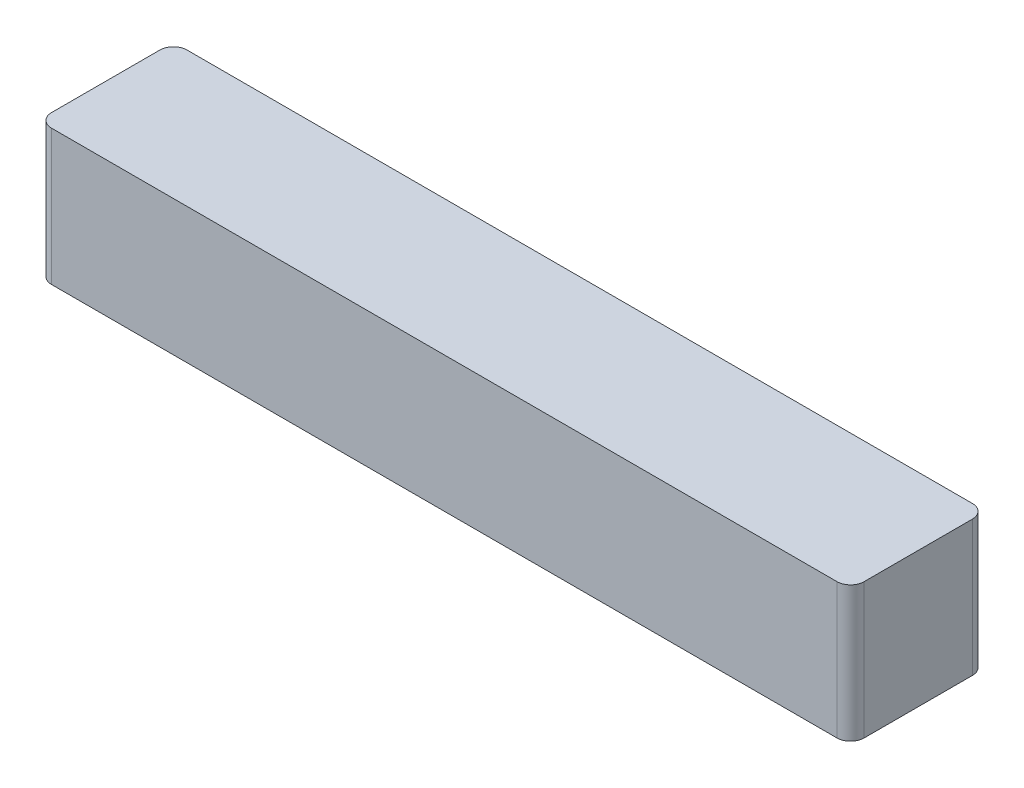
ISO-10303-21;
HEADER;
FILE_DESCRIPTION(('STEP AP214'),'2;1');
FILE_NAME('part.step','',(''),(''),'','','');
FILE_SCHEMA(('AUTOMOTIVE_DESIGN { 1 0 10303 214 1 1 1 1 }'));
ENDSEC;
DATA;
#1=APPLICATION_CONTEXT('core data for automotive mechanical design processes');
#2=APPLICATION_PROTOCOL_DEFINITION('international standard','automotive_design',2000,#1);
#3=PRODUCT_CONTEXT('',#1,'mechanical');
#4=PRODUCT('Part','Part','',(#3));
#5=PRODUCT_RELATED_PRODUCT_CATEGORY('part','',(#4));
#6=PRODUCT_DEFINITION_FORMATION('','',#4);
#7=PRODUCT_DEFINITION_CONTEXT('part definition',#1,'design');
#8=PRODUCT_DEFINITION('design','',#6,#7);
#9=PRODUCT_DEFINITION_SHAPE('','',#8);
#10=(LENGTH_UNIT() NAMED_UNIT(*) SI_UNIT(.MILLI.,.METRE.));
#11=(NAMED_UNIT(*) PLANE_ANGLE_UNIT() SI_UNIT($,.RADIAN.));
#12=(NAMED_UNIT(*) SI_UNIT($,.STERADIAN.) SOLID_ANGLE_UNIT());
#13=UNCERTAINTY_MEASURE_WITH_UNIT(LENGTH_MEASURE(1.E-05),#10,'distance_accuracy_value','');
#14=(GEOMETRIC_REPRESENTATION_CONTEXT(3) GLOBAL_UNCERTAINTY_ASSIGNED_CONTEXT((#13)) GLOBAL_UNIT_ASSIGNED_CONTEXT((#10,
#11,#12)) REPRESENTATION_CONTEXT('',''));
#15=CARTESIAN_POINT('',(0.,0.,0.));
#16=DIRECTION('',(0.,0.,1.));
#17=DIRECTION('',(1.,0.,0.));
#18=AXIS2_PLACEMENT_3D('',#15,#16,#17);
#19=CARTESIAN_POINT('',(0.,6.35,0.));
#20=DIRECTION('',(1.,0.,0.));
#21=DIRECTION('',(0.,0.,-1.));
#22=AXIS2_PLACEMENT_3D('',#19,#20,#21);
#23=PLANE('',#22);
#24=CARTESIAN_POINT('',(0.,3.175,-3.175));
#25=DIRECTION('',(-1.,0.,0.));
#26=DIRECTION('',(0.,0.,1.));
#27=AXIS2_PLACEMENT_3D('',#24,#25,#26);
#28=CIRCLE('',#27,2.4003);
#29=CARTESIAN_POINT('',(0.,3.175,-0.774700000000001));
#30=VERTEX_POINT('',#29);
#31=EDGE_CURVE('E176',#30,#30,#28,.T.);
#32=ORIENTED_EDGE('',*,*,#31,.F.);
#33=EDGE_LOOP('',(#32));
#34=FACE_BOUND('',#33,.T.);
#35=DIRECTION('',(0.,0.,1.));
#36=VECTOR('',#35,1.);
#37=CARTESIAN_POINT('',(0.,0.,0.));
#38=LINE('',#37,#36);
#39=CARTESIAN_POINT('',(0.,0.,-5.715));
#40=VERTEX_POINT('',#39);
#41=CARTESIAN_POINT('',(0.,0.,-0.635));
#42=VERTEX_POINT('',#41);
#43=EDGE_CURVE('E126',#40,#42,#38,.T.);
#44=ORIENTED_EDGE('',*,*,#43,.T.);
#45=DIRECTION('',(0.,-1.,0.));
#46=VECTOR('',#45,1.);
#47=CARTESIAN_POINT('',(0.,6.35,-0.635));
#48=LINE('',#47,#46);
#49=CARTESIAN_POINT('',(0.,6.35,-0.635));
#50=VERTEX_POINT('',#49);
#51=EDGE_CURVE('E104',#42,#50,#48,.F.);
#52=ORIENTED_EDGE('',*,*,#51,.T.);
#53=DIRECTION('',(0.,0.,1.));
#54=VECTOR('',#53,1.);
#55=CARTESIAN_POINT('',(0.,6.35,0.));
#56=LINE('',#55,#54);
#57=CARTESIAN_POINT('',(0.,6.35,-5.715));
#58=VERTEX_POINT('',#57);
#59=EDGE_CURVE('E136',#58,#50,#56,.T.);
#60=ORIENTED_EDGE('',*,*,#59,.F.);
#61=DIRECTION('',(0.,-1.,0.));
#62=VECTOR('',#61,1.);
#63=CARTESIAN_POINT('',(0.,6.35,-5.715));
#64=LINE('',#63,#62);
#65=EDGE_CURVE('E109',#58,#40,#64,.T.);
#66=ORIENTED_EDGE('',*,*,#65,.T.);
#67=EDGE_LOOP('',(#44,#52,#60,#66));
#68=FACE_BOUND('',#67,.T.);
#69=ADVANCED_FACE('F33',(#34,#68),#23,.F.);
#70=CARTESIAN_POINT('',(0.,6.35,0.));
#71=DIRECTION('',(0.,0.,-1.));
#72=DIRECTION('',(-1.,0.,0.));
#73=AXIS2_PLACEMENT_3D('',#70,#71,#72);
#74=PLANE('',#73);
#75=DIRECTION('',(1.,0.,0.));
#76=VECTOR('',#75,1.);
#77=CARTESIAN_POINT('',(0.,6.35,0.));
#78=LINE('',#77,#76);
#79=CARTESIAN_POINT('',(0.635,6.35,0.));
#80=VERTEX_POINT('',#79);
#81=CARTESIAN_POINT('',(37.465,6.35,0.));
#82=VERTEX_POINT('',#81);
#83=EDGE_CURVE('E119',#80,#82,#78,.T.);
#84=ORIENTED_EDGE('',*,*,#83,.F.);
#85=DIRECTION('',(0.,-1.,0.));
#86=VECTOR('',#85,1.);
#87=CARTESIAN_POINT('',(0.635,6.35,0.));
#88=LINE('',#87,#86);
#89=CARTESIAN_POINT('',(0.635,0.,0.));
#90=VERTEX_POINT('',#89);
#91=EDGE_CURVE('E103',#80,#90,#88,.T.);
#92=ORIENTED_EDGE('',*,*,#91,.T.);
#93=DIRECTION('',(1.,0.,0.));
#94=VECTOR('',#93,1.);
#95=CARTESIAN_POINT('',(0.,0.,0.));
#96=LINE('',#95,#94);
#97=CARTESIAN_POINT('',(37.465,0.,0.));
#98=VERTEX_POINT('',#97);
#99=EDGE_CURVE('E116',#90,#98,#96,.T.);
#100=ORIENTED_EDGE('',*,*,#99,.T.);
#101=DIRECTION('',(0.,-1.,0.));
#102=VECTOR('',#101,1.);
#103=CARTESIAN_POINT('',(37.465,6.35,0.));
#104=LINE('',#103,#102);
#105=EDGE_CURVE('E121',#98,#82,#104,.F.);
#106=ORIENTED_EDGE('',*,*,#105,.T.);
#107=EDGE_LOOP('',(#84,#92,#100,#106));
#108=FACE_BOUND('',#107,.T.);
#109=ADVANCED_FACE('F115',(#108),#74,.F.);
#110=CARTESIAN_POINT('',(38.1,6.35,0.));
#111=DIRECTION('',(-1.,0.,0.));
#112=DIRECTION('',(0.,0.,1.));
#113=AXIS2_PLACEMENT_3D('',#110,#111,#112);
#114=PLANE('',#113);
#115=DIRECTION('',(0.,0.,-1.));
#116=VECTOR('',#115,1.);
#117=CARTESIAN_POINT('',(38.1,0.,0.));
#118=LINE('',#117,#116);
#119=CARTESIAN_POINT('',(38.1,0.,-0.635));
#120=VERTEX_POINT('',#119);
#121=CARTESIAN_POINT('',(38.1,0.,-5.715));
#122=VERTEX_POINT('',#121);
#123=EDGE_CURVE('E125',#120,#122,#118,.T.);
#124=ORIENTED_EDGE('',*,*,#123,.T.);
#125=DIRECTION('',(0.,-1.,0.));
#126=VECTOR('',#125,1.);
#127=CARTESIAN_POINT('',(38.1,6.35,-5.715));
#128=LINE('',#127,#126);
#129=CARTESIAN_POINT('',(38.1,6.35,-5.715));
#130=VERTEX_POINT('',#129);
#131=EDGE_CURVE('E11',#122,#130,#128,.F.);
#132=ORIENTED_EDGE('',*,*,#131,.T.);
#133=DIRECTION('',(0.,0.,-1.));
#134=VECTOR('',#133,1.);
#135=CARTESIAN_POINT('',(38.1,6.35,0.));
#136=LINE('',#135,#134);
#137=CARTESIAN_POINT('',(38.1,6.35,-0.635));
#138=VERTEX_POINT('',#137);
#139=EDGE_CURVE('E162',#138,#130,#136,.T.);
#140=ORIENTED_EDGE('',*,*,#139,.F.);
#141=DIRECTION('',(0.,-1.,0.));
#142=VECTOR('',#141,1.);
#143=CARTESIAN_POINT('',(38.1,6.35,-0.635));
#144=LINE('',#143,#142);
#145=EDGE_CURVE('E41',#138,#120,#144,.T.);
#146=ORIENTED_EDGE('',*,*,#145,.T.);
#147=EDGE_LOOP('',(#124,#132,#140,#146));
#148=FACE_BOUND('',#147,.T.);
#149=ADVANCED_FACE('F160',(#148),#114,.F.);
#150=CARTESIAN_POINT('',(0.,6.35,-6.35));
#151=DIRECTION('',(0.,0.,1.));
#152=DIRECTION('',(1.,0.,0.));
#153=AXIS2_PLACEMENT_3D('',#150,#151,#152);
#154=PLANE('',#153);
#155=DIRECTION('',(-1.,0.,0.));
#156=VECTOR('',#155,1.);
#157=CARTESIAN_POINT('',(0.,0.,-6.35));
#158=LINE('',#157,#156);
#159=CARTESIAN_POINT('',(37.465,0.,-6.35));
#160=VERTEX_POINT('',#159);
#161=CARTESIAN_POINT('',(0.635,0.,-6.35));
#162=VERTEX_POINT('',#161);
#163=EDGE_CURVE('E129',#160,#162,#158,.T.);
#164=ORIENTED_EDGE('',*,*,#163,.T.);
#165=DIRECTION('',(0.,-1.,0.));
#166=VECTOR('',#165,1.);
#167=CARTESIAN_POINT('',(0.635,6.35,-6.35));
#168=LINE('',#167,#166);
#169=CARTESIAN_POINT('',(0.635,6.35,-6.35));
#170=VERTEX_POINT('',#169);
#171=EDGE_CURVE('E48',#162,#170,#168,.F.);
#172=ORIENTED_EDGE('',*,*,#171,.T.);
#173=DIRECTION('',(-1.,0.,0.));
#174=VECTOR('',#173,1.);
#175=CARTESIAN_POINT('',(0.,6.35,-6.35));
#176=LINE('',#175,#174);
#177=CARTESIAN_POINT('',(37.465,6.35,-6.35));
#178=VERTEX_POINT('',#177);
#179=EDGE_CURVE('E137',#178,#170,#176,.T.);
#180=ORIENTED_EDGE('',*,*,#179,.F.);
#181=DIRECTION('',(0.,-1.,0.));
#182=VECTOR('',#181,1.);
#183=CARTESIAN_POINT('',(37.465,6.35,-6.35));
#184=LINE('',#183,#182);
#185=EDGE_CURVE('E153',#178,#160,#184,.T.);
#186=ORIENTED_EDGE('',*,*,#185,.T.);
#187=EDGE_LOOP('',(#164,#172,#180,#186));
#188=FACE_BOUND('',#187,.T.);
#189=ADVANCED_FACE('F169',(#188),#154,.F.);
#190=CARTESIAN_POINT('',(0.,6.35,0.));
#191=DIRECTION('',(0.,-1.,0.));
#192=DIRECTION('',(0.,0.,-1.));
#193=AXIS2_PLACEMENT_3D('',#190,#191,#192);
#194=PLANE('',#193);
#195=ORIENTED_EDGE('',*,*,#59,.T.);
#196=CARTESIAN_POINT('',(0.635,6.35,-0.635));
#197=DIRECTION('',(0.,-1.,0.));
#198=DIRECTION('',(0.,0.,-1.));
#199=AXIS2_PLACEMENT_3D('',#196,#197,#198);
#200=CIRCLE('',#199,0.635);
#201=EDGE_CURVE('E151',#50,#80,#200,.F.);
#202=ORIENTED_EDGE('',*,*,#201,.T.);
#203=ORIENTED_EDGE('',*,*,#83,.T.);
#204=CARTESIAN_POINT('',(37.465,6.35,-0.635));
#205=DIRECTION('',(0.,-1.,0.));
#206=DIRECTION('',(0.,0.,-1.));
#207=AXIS2_PLACEMENT_3D('',#204,#205,#206);
#208=CIRCLE('',#207,0.635);
#209=EDGE_CURVE('E146',#82,#138,#208,.F.);
#210=ORIENTED_EDGE('',*,*,#209,.T.);
#211=ORIENTED_EDGE('',*,*,#139,.T.);
#212=CARTESIAN_POINT('',(37.465,6.35,-5.715));
#213=DIRECTION('',(0.,-1.,0.));
#214=DIRECTION('',(0.,0.,-1.));
#215=AXIS2_PLACEMENT_3D('',#212,#213,#214);
#216=CIRCLE('',#215,0.635);
#217=EDGE_CURVE('E55',#130,#178,#216,.F.);
#218=ORIENTED_EDGE('',*,*,#217,.T.);
#219=ORIENTED_EDGE('',*,*,#179,.T.);
#220=CARTESIAN_POINT('',(0.635,6.35,-5.715));
#221=DIRECTION('',(0.,-1.,0.));
#222=DIRECTION('',(0.,0.,-1.));
#223=AXIS2_PLACEMENT_3D('',#220,#221,#222);
#224=CIRCLE('',#223,0.635);
#225=EDGE_CURVE('E149',#170,#58,#224,.F.);
#226=ORIENTED_EDGE('',*,*,#225,.T.);
#227=EDGE_LOOP('',(#195,#202,#203,#210,#211,#218,#219,#226));
#228=FACE_BOUND('',#227,.T.);
#229=ADVANCED_FACE('F206',(#228),#194,.F.);
#230=CARTESIAN_POINT('',(0.,0.,0.));
#231=DIRECTION('',(0.,-1.,0.));
#232=DIRECTION('',(0.,0.,-1.));
#233=AXIS2_PLACEMENT_3D('',#230,#231,#232);
#234=PLANE('',#233);
#235=CARTESIAN_POINT('',(11.43,0.,-3.175));
#236=DIRECTION('',(0.,-1.,0.));
#237=DIRECTION('',(0.,0.,-1.));
#238=AXIS2_PLACEMENT_3D('',#235,#236,#237);
#239=CIRCLE('',#238,0.889000000000002);
#240=CARTESIAN_POINT('',(11.43,0.,-4.064));
#241=VERTEX_POINT('',#240);
#242=EDGE_CURVE('E188',#241,#241,#239,.T.);
#243=ORIENTED_EDGE('',*,*,#242,.F.);
#244=EDGE_LOOP('',(#243));
#245=FACE_BOUND('',#244,.T.);
#246=CARTESIAN_POINT('',(26.67,0.,-3.175));
#247=DIRECTION('',(0.,-1.,0.));
#248=DIRECTION('',(0.,0.,1.));
#249=AXIS2_PLACEMENT_3D('',#246,#247,#248);
#250=CIRCLE('',#249,0.889);
#251=CARTESIAN_POINT('',(26.67,0.,-4.064));
#252=VERTEX_POINT('',#251);
#253=EDGE_CURVE('E182',#252,#252,#250,.T.);
#254=ORIENTED_EDGE('',*,*,#253,.F.);
#255=EDGE_LOOP('',(#254));
#256=FACE_BOUND('',#255,.T.);
#257=ORIENTED_EDGE('',*,*,#99,.F.);
#258=CARTESIAN_POINT('',(0.635,0.,-0.635));
#259=DIRECTION('',(0.,-1.,0.));
#260=DIRECTION('',(0.,0.,-1.));
#261=AXIS2_PLACEMENT_3D('',#258,#259,#260);
#262=CIRCLE('',#261,0.635);
#263=EDGE_CURVE('E99',#90,#42,#262,.T.);
#264=ORIENTED_EDGE('',*,*,#263,.T.);
#265=ORIENTED_EDGE('',*,*,#43,.F.);
#266=CARTESIAN_POINT('',(0.635,0.,-5.715));
#267=DIRECTION('',(0.,-1.,0.));
#268=DIRECTION('',(0.,0.,-1.));
#269=AXIS2_PLACEMENT_3D('',#266,#267,#268);
#270=CIRCLE('',#269,0.635);
#271=EDGE_CURVE('E110',#40,#162,#270,.T.);
#272=ORIENTED_EDGE('',*,*,#271,.T.);
#273=ORIENTED_EDGE('',*,*,#163,.F.);
#274=CARTESIAN_POINT('',(37.465,0.,-5.715));
#275=DIRECTION('',(0.,-1.,0.));
#276=DIRECTION('',(0.,0.,-1.));
#277=AXIS2_PLACEMENT_3D('',#274,#275,#276);
#278=CIRCLE('',#277,0.635);
#279=EDGE_CURVE('E140',#160,#122,#278,.T.);
#280=ORIENTED_EDGE('',*,*,#279,.T.);
#281=ORIENTED_EDGE('',*,*,#123,.F.);
#282=CARTESIAN_POINT('',(37.465,0.,-0.635));
#283=DIRECTION('',(0.,-1.,0.));
#284=DIRECTION('',(0.,0.,-1.));
#285=AXIS2_PLACEMENT_3D('',#282,#283,#284);
#286=CIRCLE('',#285,0.635);
#287=EDGE_CURVE('E120',#120,#98,#286,.T.);
#288=ORIENTED_EDGE('',*,*,#287,.T.);
#289=EDGE_LOOP('',(#257,#264,#265,#272,#273,#280,#281,#288));
#290=FACE_BOUND('',#289,.T.);
#291=ADVANCED_FACE('F123',(#245,#256,#290),#234,.T.);
#292=CARTESIAN_POINT('',(8.89,3.175,-3.175));
#293=DIRECTION('',(-1.,0.,0.));
#294=DIRECTION('',(0.,0.,1.));
#295=AXIS2_PLACEMENT_3D('',#292,#293,#294);
#296=CYLINDRICAL_SURFACE('',#295,2.4003);
#297=CARTESIAN_POINT('',(8.89,3.175,-3.175));
#298=DIRECTION('',(-1.,0.,0.));
#299=DIRECTION('',(0.,0.,1.));
#300=AXIS2_PLACEMENT_3D('',#297,#298,#299);
#301=CIRCLE('',#300,2.4003);
#302=CARTESIAN_POINT('',(8.89,3.175,-0.774700000000001));
#303=VERTEX_POINT('',#302);
#304=EDGE_CURVE('E131',#303,#303,#301,.T.);
#305=ORIENTED_EDGE('',*,*,#304,.F.);
#306=EDGE_LOOP('',(#305));
#307=FACE_BOUND('',#306,.T.);
#308=ORIENTED_EDGE('',*,*,#31,.T.);
#309=EDGE_LOOP('',(#308));
#310=FACE_BOUND('',#309,.T.);
#311=ADVANCED_FACE('F205',(#307,#310),#296,.F.);
#312=CARTESIAN_POINT('',(8.89,3.175,-3.175));
#313=DIRECTION('',(-1.,0.,0.));
#314=DIRECTION('',(0.,0.,1.));
#315=AXIS2_PLACEMENT_3D('',#312,#313,#314);
#316=PLANE('',#315);
#317=ORIENTED_EDGE('',*,*,#304,.T.);
#318=EDGE_LOOP('',(#317));
#319=FACE_BOUND('',#318,.T.);
#320=ADVANCED_FACE('F236',(#319),#316,.T.);
#321=CARTESIAN_POINT('',(0.635,6.35,-0.635));
#322=DIRECTION('',(0.,-1.,0.));
#323=DIRECTION('',(0.,0.,-1.));
#324=AXIS2_PLACEMENT_3D('',#321,#322,#323);
#325=CYLINDRICAL_SURFACE('',#324,0.635);
#326=ORIENTED_EDGE('',*,*,#201,.F.);
#327=ORIENTED_EDGE('',*,*,#51,.F.);
#328=ORIENTED_EDGE('',*,*,#263,.F.);
#329=ORIENTED_EDGE('',*,*,#91,.F.);
#330=EDGE_LOOP('',(#326,#327,#328,#329));
#331=FACE_BOUND('',#330,.T.);
#332=ADVANCED_FACE('F102',(#331),#325,.T.);
#333=CARTESIAN_POINT('',(0.635,6.35,-5.715));
#334=DIRECTION('',(0.,-1.,0.));
#335=DIRECTION('',(0.,0.,-1.));
#336=AXIS2_PLACEMENT_3D('',#333,#334,#335);
#337=CYLINDRICAL_SURFACE('',#336,0.635);
#338=ORIENTED_EDGE('',*,*,#225,.F.);
#339=ORIENTED_EDGE('',*,*,#171,.F.);
#340=ORIENTED_EDGE('',*,*,#271,.F.);
#341=ORIENTED_EDGE('',*,*,#65,.F.);
#342=EDGE_LOOP('',(#338,#339,#340,#341));
#343=FACE_BOUND('',#342,.T.);
#344=ADVANCED_FACE('F235',(#343),#337,.T.);
#345=CARTESIAN_POINT('',(37.465,6.35,-5.715));
#346=DIRECTION('',(0.,-1.,0.));
#347=DIRECTION('',(0.,0.,-1.));
#348=AXIS2_PLACEMENT_3D('',#345,#346,#347);
#349=CYLINDRICAL_SURFACE('',#348,0.635);
#350=ORIENTED_EDGE('',*,*,#217,.F.);
#351=ORIENTED_EDGE('',*,*,#131,.F.);
#352=ORIENTED_EDGE('',*,*,#279,.F.);
#353=ORIENTED_EDGE('',*,*,#185,.F.);
#354=EDGE_LOOP('',(#350,#351,#352,#353));
#355=FACE_BOUND('',#354,.T.);
#356=ADVANCED_FACE('F168',(#355),#349,.T.);
#357=CARTESIAN_POINT('',(37.465,6.35,-0.635));
#358=DIRECTION('',(0.,-1.,0.));
#359=DIRECTION('',(0.,0.,-1.));
#360=AXIS2_PLACEMENT_3D('',#357,#358,#359);
#361=CYLINDRICAL_SURFACE('',#360,0.635);
#362=ORIENTED_EDGE('',*,*,#209,.F.);
#363=ORIENTED_EDGE('',*,*,#105,.F.);
#364=ORIENTED_EDGE('',*,*,#287,.F.);
#365=ORIENTED_EDGE('',*,*,#145,.F.);
#366=EDGE_LOOP('',(#362,#363,#364,#365));
#367=FACE_BOUND('',#366,.T.);
#368=ADVANCED_FACE('F35',(#367),#361,.T.);
#369=CARTESIAN_POINT('',(26.67,3.81,-3.175));
#370=DIRECTION('',(0.,-1.,0.));
#371=DIRECTION('',(0.,0.,-1.));
#372=AXIS2_PLACEMENT_3D('',#369,#370,#371);
#373=CYLINDRICAL_SURFACE('',#372,0.889);
#374=CARTESIAN_POINT('',(26.67,3.81,-3.175));
#375=DIRECTION('',(0.,-1.,0.));
#376=DIRECTION('',(0.,0.,1.));
#377=AXIS2_PLACEMENT_3D('',#374,#375,#376);
#378=CIRCLE('',#377,0.889);
#379=CARTESIAN_POINT('',(26.67,3.81,-4.064));
#380=VERTEX_POINT('',#379);
#381=EDGE_CURVE('E185',#380,#380,#378,.T.);
#382=CARTESIAN_POINT('',(26.67,3.81,-4.064));
#383=CARTESIAN_POINT('',(26.67,3.7703125,-4.064));
#384=CARTESIAN_POINT('',(26.67,3.730625,-4.064));
#385=CARTESIAN_POINT('',(26.67,3.65125,-4.064));
#386=CARTESIAN_POINT('',(26.67,3.6115625,-4.064));
#387=CARTESIAN_POINT('',(26.67,3.5321875,-4.064));
#388=CARTESIAN_POINT('',(26.67,3.4925,-4.064));
#389=CARTESIAN_POINT('',(26.67,3.413125,-4.064));
#390=CARTESIAN_POINT('',(26.67,3.3734375,-4.064));
#391=CARTESIAN_POINT('',(26.67,3.2940625,-4.064));
#392=CARTESIAN_POINT('',(26.67,3.254375,-4.064));
#393=CARTESIAN_POINT('',(26.67,3.175,-4.064));
#394=CARTESIAN_POINT('',(26.67,3.1353125,-4.064));
#395=CARTESIAN_POINT('',(26.67,3.0559375,-4.064));
#396=CARTESIAN_POINT('',(26.67,3.01625,-4.064));
#397=CARTESIAN_POINT('',(26.67,2.936875,-4.064));
#398=CARTESIAN_POINT('',(26.67,2.8971875,-4.064));
#399=CARTESIAN_POINT('',(26.67,2.8178125,-4.064));
#400=CARTESIAN_POINT('',(26.67,2.778125,-4.064));
#401=CARTESIAN_POINT('',(26.67,2.69875,-4.064));
#402=CARTESIAN_POINT('',(26.67,2.6590625,-4.064));
#403=CARTESIAN_POINT('',(26.67,2.5796875,-4.064));
#404=CARTESIAN_POINT('',(26.67,2.54,-4.064));
#405=CARTESIAN_POINT('',(26.67,2.460625,-4.064));
#406=CARTESIAN_POINT('',(26.67,2.4209375,-4.064));
#407=CARTESIAN_POINT('',(26.67,2.3415625,-4.064));
#408=CARTESIAN_POINT('',(26.67,2.301875,-4.064));
#409=CARTESIAN_POINT('',(26.67,2.2225,-4.064));
#410=CARTESIAN_POINT('',(26.67,2.1828125,-4.064));
#411=CARTESIAN_POINT('',(26.67,2.1034375,-4.064));
#412=CARTESIAN_POINT('',(26.67,2.06375,-4.064));
#413=CARTESIAN_POINT('',(26.67,1.984375,-4.064));
#414=CARTESIAN_POINT('',(26.67,1.9446875,-4.064));
#415=CARTESIAN_POINT('',(26.67,1.8653125,-4.064));
#416=CARTESIAN_POINT('',(26.67,1.825625,-4.064));
#417=CARTESIAN_POINT('',(26.67,1.74625,-4.064));
#418=CARTESIAN_POINT('',(26.67,1.7065625,-4.064));
#419=CARTESIAN_POINT('',(26.67,1.6271875,-4.064));
#420=CARTESIAN_POINT('',(26.67,1.5875,-4.064));
#421=CARTESIAN_POINT('',(26.67,1.508125,-4.064));
#422=CARTESIAN_POINT('',(26.67,1.4684375,-4.064));
#423=CARTESIAN_POINT('',(26.67,1.3890625,-4.064));
#424=CARTESIAN_POINT('',(26.67,1.349375,-4.064));
#425=CARTESIAN_POINT('',(26.67,1.27,-4.064));
#426=CARTESIAN_POINT('',(26.67,1.2303125,-4.064));
#427=CARTESIAN_POINT('',(26.67,1.1509375,-4.064));
#428=CARTESIAN_POINT('',(26.67,1.11125,-4.064));
#429=CARTESIAN_POINT('',(26.67,1.031875,-4.064));
#430=CARTESIAN_POINT('',(26.67,0.9921875,-4.064));
#431=CARTESIAN_POINT('',(26.67,0.9128125,-4.064));
#432=CARTESIAN_POINT('',(26.67,0.873125,-4.064));
#433=CARTESIAN_POINT('',(26.67,0.79375,-4.064));
#434=CARTESIAN_POINT('',(26.67,0.7540625,-4.064));
#435=CARTESIAN_POINT('',(26.67,0.6746875,-4.064));
#436=CARTESIAN_POINT('',(26.67,0.635,-4.064));
#437=CARTESIAN_POINT('',(26.67,0.555625,-4.064));
#438=CARTESIAN_POINT('',(26.67,0.5159375,-4.064));
#439=CARTESIAN_POINT('',(26.67,0.4365625,-4.064));
#440=CARTESIAN_POINT('',(26.67,0.396875,-4.064));
#441=CARTESIAN_POINT('',(26.67,0.3175,-4.064));
#442=CARTESIAN_POINT('',(26.67,0.2778125,-4.064));
#443=CARTESIAN_POINT('',(26.67,0.1984375,-4.064));
#444=CARTESIAN_POINT('',(26.67,0.15875,-4.064));
#445=CARTESIAN_POINT('',(26.67,0.0793749999999999,-4.064));
#446=CARTESIAN_POINT('',(26.67,0.0396874999999999,-4.064));
#447=CARTESIAN_POINT('',(26.67,0.,-4.064));
#448=B_SPLINE_CURVE_WITH_KNOTS('',3,(#382,#383,#384,#385,#386,#387,#388,#389,#390,#391,#392,
#393,#394,#395,#396,#397,#398,#399,#400,#401,#402,#403,#404,#405,#406,#407,#408,#409,#410,#411,
#412,#413,#414,#415,#416,#417,#418,#419,#420,#421,#422,#423,#424,#425,#426,#427,#428,#429,#430,
#431,#432,#433,#434,#435,#436,#437,#438,#439,#440,#441,#442,#443,#444,#445,#446,#447),
.UNSPECIFIED.,.F.,.F.,(4,2,2,2,2,2,2,2,2,2,2,2,2,2,2,2,2,2,2,2,2,2,2,2,2,2,2,2,2,2,2,2,4),(0.,
0.1190625,0.238125,0.3571875,0.47625,0.5953125,0.714375,0.8334375,0.9525,1.0715625,1.190625,
1.3096875,1.42875,1.5478125,1.666875,1.7859375,1.905,2.0240625,2.143125,2.2621875,2.38125,
2.5003125,2.619375,2.7384375,2.8575,2.9765625,3.095625,3.2146875,3.33375,3.4528125,3.571875,
3.6909375,3.81),.UNSPECIFIED.);
#449=EDGE_CURVE('BSEAM210',#380,#252,#448,.T.);
#450=ORIENTED_EDGE('',*,*,#381,.F.);
#451=ORIENTED_EDGE('',*,*,#253,.T.);
#452=ORIENTED_EDGE('',*,*,#449,.T.);
#453=ORIENTED_EDGE('',*,*,#449,.F.);
#454=EDGE_LOOP('',(#450,#452,#451,#453));
#455=FACE_BOUND('',#454,.T.);
#456=ADVANCED_FACE('F210',(#455),#373,.F.);
#457=CARTESIAN_POINT('',(26.67,3.81,-3.175));
#458=DIRECTION('',(0.,1.,0.));
#459=DIRECTION('',(0.,0.,1.));
#460=AXIS2_PLACEMENT_3D('',#457,#458,#459);
#461=PLANE('',#460);
#462=ORIENTED_EDGE('',*,*,#381,.T.);
#463=EDGE_LOOP('',(#462));
#464=FACE_BOUND('',#463,.T.);
#465=ADVANCED_FACE('F199',(#464),#461,.F.);
#466=CARTESIAN_POINT('',(11.43,3.81,-3.175));
#467=DIRECTION('',(0.,-1.,0.));
#468=DIRECTION('',(0.,0.,-1.));
#469=AXIS2_PLACEMENT_3D('',#466,#467,#468);
#470=CYLINDRICAL_SURFACE('',#469,0.889000000000002);
#471=CARTESIAN_POINT('',(11.43,3.81,-3.175));
#472=DIRECTION('',(0.,-1.,0.));
#473=DIRECTION('',(0.,0.,-1.));
#474=AXIS2_PLACEMENT_3D('',#471,#472,#473);
#475=CIRCLE('',#474,0.889000000000002);
#476=CARTESIAN_POINT('',(11.43,3.81,-4.064));
#477=VERTEX_POINT('',#476);
#478=EDGE_CURVE('E179',#477,#477,#475,.T.);
#479=CARTESIAN_POINT('',(11.43,3.81,-4.064));
#480=CARTESIAN_POINT('',(11.43,3.7703125,-4.064));
#481=CARTESIAN_POINT('',(11.43,3.730625,-4.064));
#482=CARTESIAN_POINT('',(11.43,3.65125,-4.064));
#483=CARTESIAN_POINT('',(11.43,3.6115625,-4.064));
#484=CARTESIAN_POINT('',(11.43,3.5321875,-4.064));
#485=CARTESIAN_POINT('',(11.43,3.4925,-4.064));
#486=CARTESIAN_POINT('',(11.43,3.413125,-4.064));
#487=CARTESIAN_POINT('',(11.43,3.3734375,-4.064));
#488=CARTESIAN_POINT('',(11.43,3.2940625,-4.064));
#489=CARTESIAN_POINT('',(11.43,3.254375,-4.064));
#490=CARTESIAN_POINT('',(11.43,3.175,-4.064));
#491=CARTESIAN_POINT('',(11.43,3.1353125,-4.064));
#492=CARTESIAN_POINT('',(11.43,3.0559375,-4.064));
#493=CARTESIAN_POINT('',(11.43,3.01625,-4.064));
#494=CARTESIAN_POINT('',(11.43,2.936875,-4.064));
#495=CARTESIAN_POINT('',(11.43,2.8971875,-4.064));
#496=CARTESIAN_POINT('',(11.43,2.8178125,-4.064));
#497=CARTESIAN_POINT('',(11.43,2.778125,-4.064));
#498=CARTESIAN_POINT('',(11.43,2.69875,-4.064));
#499=CARTESIAN_POINT('',(11.43,2.6590625,-4.064));
#500=CARTESIAN_POINT('',(11.43,2.5796875,-4.064));
#501=CARTESIAN_POINT('',(11.43,2.54,-4.064));
#502=CARTESIAN_POINT('',(11.43,2.460625,-4.064));
#503=CARTESIAN_POINT('',(11.43,2.4209375,-4.064));
#504=CARTESIAN_POINT('',(11.43,2.3415625,-4.064));
#505=CARTESIAN_POINT('',(11.43,2.301875,-4.064));
#506=CARTESIAN_POINT('',(11.43,2.2225,-4.064));
#507=CARTESIAN_POINT('',(11.43,2.1828125,-4.064));
#508=CARTESIAN_POINT('',(11.43,2.1034375,-4.064));
#509=CARTESIAN_POINT('',(11.43,2.06375,-4.064));
#510=CARTESIAN_POINT('',(11.43,1.984375,-4.064));
#511=CARTESIAN_POINT('',(11.43,1.9446875,-4.064));
#512=CARTESIAN_POINT('',(11.43,1.8653125,-4.064));
#513=CARTESIAN_POINT('',(11.43,1.825625,-4.064));
#514=CARTESIAN_POINT('',(11.43,1.74625,-4.064));
#515=CARTESIAN_POINT('',(11.43,1.7065625,-4.064));
#516=CARTESIAN_POINT('',(11.43,1.6271875,-4.064));
#517=CARTESIAN_POINT('',(11.43,1.5875,-4.064));
#518=CARTESIAN_POINT('',(11.43,1.508125,-4.064));
#519=CARTESIAN_POINT('',(11.43,1.4684375,-4.064));
#520=CARTESIAN_POINT('',(11.43,1.3890625,-4.064));
#521=CARTESIAN_POINT('',(11.43,1.349375,-4.064));
#522=CARTESIAN_POINT('',(11.43,1.27,-4.064));
#523=CARTESIAN_POINT('',(11.43,1.2303125,-4.064));
#524=CARTESIAN_POINT('',(11.43,1.1509375,-4.064));
#525=CARTESIAN_POINT('',(11.43,1.11125,-4.064));
#526=CARTESIAN_POINT('',(11.43,1.031875,-4.064));
#527=CARTESIAN_POINT('',(11.43,0.9921875,-4.064));
#528=CARTESIAN_POINT('',(11.43,0.9128125,-4.064));
#529=CARTESIAN_POINT('',(11.43,0.873125,-4.064));
#530=CARTESIAN_POINT('',(11.43,0.79375,-4.064));
#531=CARTESIAN_POINT('',(11.43,0.7540625,-4.064));
#532=CARTESIAN_POINT('',(11.43,0.6746875,-4.064));
#533=CARTESIAN_POINT('',(11.43,0.635,-4.064));
#534=CARTESIAN_POINT('',(11.43,0.555625,-4.064));
#535=CARTESIAN_POINT('',(11.43,0.5159375,-4.064));
#536=CARTESIAN_POINT('',(11.43,0.4365625,-4.064));
#537=CARTESIAN_POINT('',(11.43,0.396875,-4.064));
#538=CARTESIAN_POINT('',(11.43,0.3175,-4.064));
#539=CARTESIAN_POINT('',(11.43,0.2778125,-4.064));
#540=CARTESIAN_POINT('',(11.43,0.1984375,-4.064));
#541=CARTESIAN_POINT('',(11.43,0.15875,-4.064));
#542=CARTESIAN_POINT('',(11.43,0.0793749999999999,-4.064));
#543=CARTESIAN_POINT('',(11.43,0.0396874999999999,-4.064));
#544=CARTESIAN_POINT('',(11.43,0.,-4.064));
#545=B_SPLINE_CURVE_WITH_KNOTS('',3,(#479,#480,#481,#482,#483,#484,#485,#486,#487,#488,#489,
#490,#491,#492,#493,#494,#495,#496,#497,#498,#499,#500,#501,#502,#503,#504,#505,#506,#507,#508,
#509,#510,#511,#512,#513,#514,#515,#516,#517,#518,#519,#520,#521,#522,#523,#524,#525,#526,#527,
#528,#529,#530,#531,#532,#533,#534,#535,#536,#537,#538,#539,#540,#541,#542,#543,#544),
.UNSPECIFIED.,.F.,.F.,(4,2,2,2,2,2,2,2,2,2,2,2,2,2,2,2,2,2,2,2,2,2,2,2,2,2,2,2,2,2,2,2,4),(0.,
0.1190625,0.238125,0.3571875,0.47625,0.5953125,0.714375,0.8334375,0.9525,1.0715625,1.190625,
1.3096875,1.42875,1.5478125,1.666875,1.7859375,1.905,2.0240625,2.143125,2.2621875,2.38125,
2.5003125,2.619375,2.7384375,2.8575,2.9765625,3.095625,3.2146875,3.33375,3.4528125,3.571875,
3.6909375,3.81),.UNSPECIFIED.);
#546=EDGE_CURVE('BSEAM196',#477,#241,#545,.T.);
#547=ORIENTED_EDGE('',*,*,#478,.F.);
#548=ORIENTED_EDGE('',*,*,#242,.T.);
#549=ORIENTED_EDGE('',*,*,#546,.T.);
#550=ORIENTED_EDGE('',*,*,#546,.F.);
#551=EDGE_LOOP('',(#547,#549,#548,#550));
#552=FACE_BOUND('',#551,.T.);
#553=ADVANCED_FACE('F196',(#552),#470,.F.);
#554=CARTESIAN_POINT('',(11.43,3.81,-3.175));
#555=DIRECTION('',(0.,-1.,0.));
#556=DIRECTION('',(0.,0.,-1.));
#557=AXIS2_PLACEMENT_3D('',#554,#555,#556);
#558=PLANE('',#557);
#559=ORIENTED_EDGE('',*,*,#478,.T.);
#560=EDGE_LOOP('',(#559));
#561=FACE_BOUND('',#560,.T.);
#562=ADVANCED_FACE('F194',(#561),#558,.T.);
#563=CLOSED_SHELL('',(#69,#109,#149,#189,#229,#291,#311,#320,#332,#344,#356,#368,#456,#465,#553,#562));
#564=MANIFOLD_SOLID_BREP('B2',#563);
#565=ADVANCED_BREP_SHAPE_REPRESENTATION('',(#18,#564),#14);
#566=SHAPE_DEFINITION_REPRESENTATION(#9,#565);
ENDSEC;
END-ISO-10303-21;
